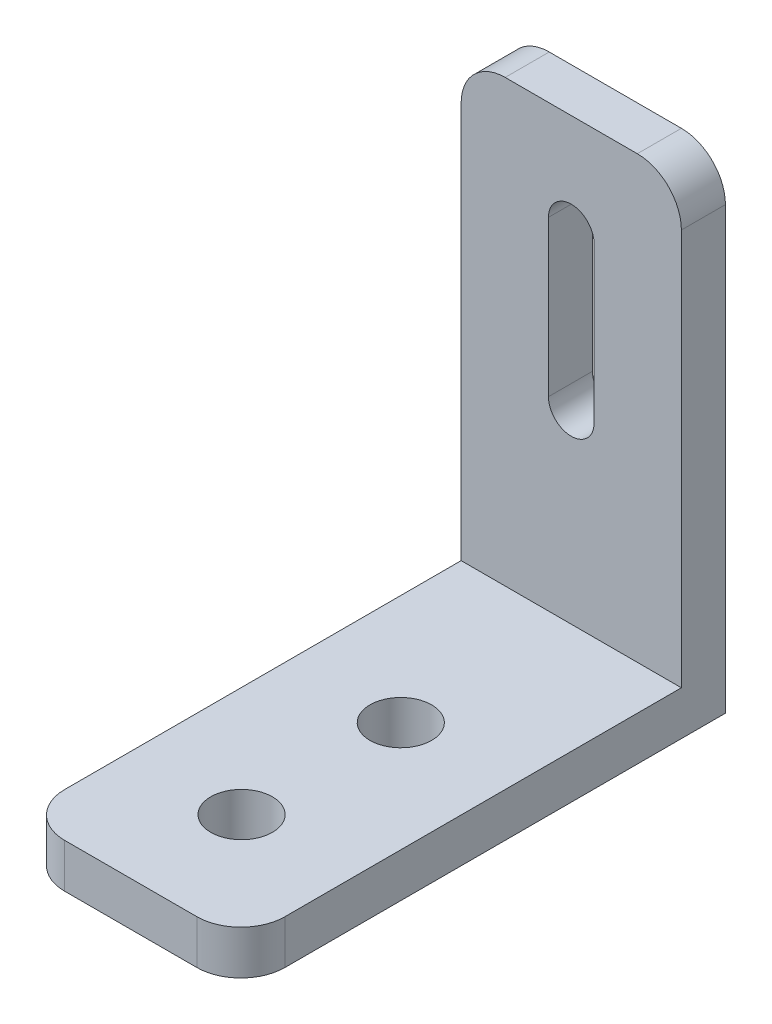
ISO-10303-21;
HEADER;
FILE_DESCRIPTION(('STEP AP214'),'2;1');
FILE_NAME('part.step','',(''),(''),'','','');
FILE_SCHEMA(('AUTOMOTIVE_DESIGN { 1 0 10303 214 1 1 1 1 }'));
ENDSEC;
DATA;
#1=APPLICATION_CONTEXT('core data for automotive mechanical design processes');
#2=APPLICATION_PROTOCOL_DEFINITION('international standard','automotive_design',2000,#1);
#3=PRODUCT_CONTEXT('',#1,'mechanical');
#4=PRODUCT('Part','Part','',(#3));
#5=PRODUCT_RELATED_PRODUCT_CATEGORY('part','',(#4));
#6=PRODUCT_DEFINITION_FORMATION('','',#4);
#7=PRODUCT_DEFINITION_CONTEXT('part definition',#1,'design');
#8=PRODUCT_DEFINITION('design','',#6,#7);
#9=PRODUCT_DEFINITION_SHAPE('','',#8);
#10=(LENGTH_UNIT() NAMED_UNIT(*) SI_UNIT(.MILLI.,.METRE.));
#11=(NAMED_UNIT(*) PLANE_ANGLE_UNIT() SI_UNIT($,.RADIAN.));
#12=(NAMED_UNIT(*) SI_UNIT($,.STERADIAN.) SOLID_ANGLE_UNIT());
#13=UNCERTAINTY_MEASURE_WITH_UNIT(LENGTH_MEASURE(1.E-05),#10,'distance_accuracy_value','');
#14=(GEOMETRIC_REPRESENTATION_CONTEXT(3) GLOBAL_UNCERTAINTY_ASSIGNED_CONTEXT((#13)) GLOBAL_UNIT_ASSIGNED_CONTEXT((#10,
#11,#12)) REPRESENTATION_CONTEXT('',''));
#15=CARTESIAN_POINT('',(0.,0.,0.));
#16=DIRECTION('',(0.,0.,1.));
#17=DIRECTION('',(1.,0.,0.));
#18=AXIS2_PLACEMENT_3D('',#15,#16,#17);
#19=CARTESIAN_POINT('',(50.,0.,-110.));
#20=DIRECTION('',(0.,0.,1.));
#21=DIRECTION('',(1.,0.,0.));
#22=AXIS2_PLACEMENT_3D('',#19,#20,#21);
#23=PLANE('',#22);
#24=DIRECTION('',(0.,1.,0.));
#25=VECTOR('',#24,1.);
#26=CARTESIAN_POINT('',(30.1844729939965,77.3929442277711,-110.));
#27=LINE('',#26,#25);
#28=CARTESIAN_POINT('',(30.1844729939965,42.136183712672,-110.));
#29=VERTEX_POINT('',#28);
#30=CARTESIAN_POINT('',(30.1844729939965,77.3929442277711,-110.));
#31=VERTEX_POINT('',#30);
#32=EDGE_CURVE('E155',#29,#31,#27,.T.);
#33=ORIENTED_EDGE('',*,*,#32,.T.);
#34=CARTESIAN_POINT('',(25.,77.3929442277711,-110.));
#35=DIRECTION('',(0.,0.,1.));
#36=DIRECTION('',(1.,0.,0.));
#37=AXIS2_PLACEMENT_3D('',#34,#35,#36);
#38=CIRCLE('',#37,5.18447299399646);
#39=CARTESIAN_POINT('',(19.8155270060035,77.3929442277711,-110.));
#40=VERTEX_POINT('',#39);
#41=EDGE_CURVE('E148',#31,#40,#38,.T.);
#42=ORIENTED_EDGE('',*,*,#41,.T.);
#43=DIRECTION('',(0.,-1.,0.));
#44=VECTOR('',#43,1.);
#45=CARTESIAN_POINT('',(19.8155270060035,77.3929442277711,-110.));
#46=LINE('',#45,#44);
#47=CARTESIAN_POINT('',(19.8155270060035,42.136183712672,-110.));
#48=VERTEX_POINT('',#47);
#49=EDGE_CURVE('E158',#40,#48,#46,.T.);
#50=ORIENTED_EDGE('',*,*,#49,.T.);
#51=CARTESIAN_POINT('',(25.,42.136183712672,-110.));
#52=DIRECTION('',(0.,0.,1.));
#53=DIRECTION('',(1.,0.,0.));
#54=AXIS2_PLACEMENT_3D('',#51,#52,#53);
#55=CIRCLE('',#54,5.18447299399646);
#56=EDGE_CURVE('E61',#48,#29,#55,.T.);
#57=ORIENTED_EDGE('',*,*,#56,.T.);
#58=EDGE_LOOP('',(#33,#42,#50,#57));
#59=FACE_BOUND('',#58,.T.);
#60=DIRECTION('',(0.,1.,0.));
#61=VECTOR('',#60,1.);
#62=CARTESIAN_POINT('',(0.,0.,-110.));
#63=LINE('',#62,#61);
#64=CARTESIAN_POINT('',(0.,-9.99999999999999,-110.));
#65=VERTEX_POINT('',#64);
#66=CARTESIAN_POINT('',(0.,89.9999999999996,-110.));
#67=VERTEX_POINT('',#66);
#68=EDGE_CURVE('E192',#65,#67,#63,.T.);
#69=ORIENTED_EDGE('',*,*,#68,.T.);
#70=CARTESIAN_POINT('',(10.,89.9999999999996,-110.));
#71=DIRECTION('',(0.,0.,1.));
#72=DIRECTION('',(1.,0.,0.));
#73=AXIS2_PLACEMENT_3D('',#70,#71,#72);
#74=CIRCLE('',#73,10.);
#75=CARTESIAN_POINT('',(10.,99.9999999999996,-110.));
#76=VERTEX_POINT('',#75);
#77=EDGE_CURVE('E260',#67,#76,#74,.F.);
#78=ORIENTED_EDGE('',*,*,#77,.T.);
#79=DIRECTION('',(-1.,0.,0.));
#80=VECTOR('',#79,1.);
#81=CARTESIAN_POINT('',(50.,99.9999999999996,-110.));
#82=LINE('',#81,#80);
#83=CARTESIAN_POINT('',(40.,99.9999999999996,-110.));
#84=VERTEX_POINT('',#83);
#85=EDGE_CURVE('E245',#84,#76,#82,.T.);
#86=ORIENTED_EDGE('',*,*,#85,.F.);
#87=CARTESIAN_POINT('',(40.,89.9999999999996,-110.));
#88=DIRECTION('',(0.,0.,1.));
#89=DIRECTION('',(1.,0.,0.));
#90=AXIS2_PLACEMENT_3D('',#87,#88,#89);
#91=CIRCLE('',#90,10.);
#92=CARTESIAN_POINT('',(50.,89.9999999999996,-110.));
#93=VERTEX_POINT('',#92);
#94=EDGE_CURVE('E257',#84,#93,#91,.F.);
#95=ORIENTED_EDGE('',*,*,#94,.T.);
#96=DIRECTION('',(0.,1.,0.));
#97=VECTOR('',#96,1.);
#98=CARTESIAN_POINT('',(50.,0.,-110.));
#99=LINE('',#98,#97);
#100=CARTESIAN_POINT('',(50.,-9.99999999999999,-110.));
#101=VERTEX_POINT('',#100);
#102=EDGE_CURVE('E198',#101,#93,#99,.T.);
#103=ORIENTED_EDGE('',*,*,#102,.F.);
#104=DIRECTION('',(-1.,0.,0.));
#105=VECTOR('',#104,1.);
#106=CARTESIAN_POINT('',(50.,-9.99999999999999,-110.));
#107=LINE('',#106,#105);
#108=EDGE_CURVE('E213',#101,#65,#107,.T.);
#109=ORIENTED_EDGE('',*,*,#108,.T.);
#110=EDGE_LOOP('',(#69,#78,#86,#95,#103,#109));
#111=FACE_BOUND('',#110,.T.);
#112=ADVANCED_FACE('F45',(#59,#111),#23,.F.);
#113=CARTESIAN_POINT('',(50.,99.9999999999996,-100.));
#114=DIRECTION('',(0.,1.,0.));
#115=DIRECTION('',(0.,0.,1.));
#116=AXIS2_PLACEMENT_3D('',#113,#114,#115);
#117=PLANE('',#116);
#118=ORIENTED_EDGE('',*,*,#85,.T.);
#119=DIRECTION('',(0.,0.,-1.));
#120=VECTOR('',#119,1.);
#121=CARTESIAN_POINT('',(10.,99.9999999999996,-100.));
#122=LINE('',#121,#120);
#123=CARTESIAN_POINT('',(10.,99.9999999999996,-100.));
#124=VERTEX_POINT('',#123);
#125=EDGE_CURVE('E267',#76,#124,#122,.F.);
#126=ORIENTED_EDGE('',*,*,#125,.T.);
#127=DIRECTION('',(-1.,0.,0.));
#128=VECTOR('',#127,1.);
#129=CARTESIAN_POINT('',(50.,99.9999999999996,-100.));
#130=LINE('',#129,#128);
#131=CARTESIAN_POINT('',(40.,99.9999999999996,-100.));
#132=VERTEX_POINT('',#131);
#133=EDGE_CURVE('E241',#132,#124,#130,.T.);
#134=ORIENTED_EDGE('',*,*,#133,.F.);
#135=DIRECTION('',(0.,0.,-1.));
#136=VECTOR('',#135,1.);
#137=CARTESIAN_POINT('',(40.,99.9999999999996,-110.));
#138=LINE('',#137,#136);
#139=EDGE_CURVE('E263',#132,#84,#138,.T.);
#140=ORIENTED_EDGE('',*,*,#139,.T.);
#141=EDGE_LOOP('',(#118,#126,#134,#140));
#142=FACE_BOUND('',#141,.T.);
#143=ADVANCED_FACE('F335',(#142),#117,.T.);
#144=CARTESIAN_POINT('',(50.,0.,-100.));
#145=DIRECTION('',(0.,0.,1.));
#146=DIRECTION('',(1.,0.,0.));
#147=AXIS2_PLACEMENT_3D('',#144,#145,#146);
#148=PLANE('',#147);
#149=CARTESIAN_POINT('',(25.,77.3929442277711,-100.));
#150=DIRECTION('',(0.,0.,1.));
#151=DIRECTION('',(1.,0.,0.));
#152=AXIS2_PLACEMENT_3D('',#149,#150,#151);
#153=CIRCLE('',#152,5.18447299399646);
#154=CARTESIAN_POINT('',(30.1844729939965,77.3929442277711,-100.));
#155=VERTEX_POINT('',#154);
#156=CARTESIAN_POINT('',(19.8155270060035,77.3929442277711,-100.));
#157=VERTEX_POINT('',#156);
#158=EDGE_CURVE('E69',#155,#157,#153,.T.);
#159=ORIENTED_EDGE('',*,*,#158,.F.);
#160=DIRECTION('',(0.,1.,0.));
#161=VECTOR('',#160,1.);
#162=CARTESIAN_POINT('',(30.1844729939965,77.3929442277711,-100.));
#163=LINE('',#162,#161);
#164=CARTESIAN_POINT('',(30.1844729939965,42.136183712672,-100.));
#165=VERTEX_POINT('',#164);
#166=EDGE_CURVE('E166',#165,#155,#163,.T.);
#167=ORIENTED_EDGE('',*,*,#166,.F.);
#168=CARTESIAN_POINT('',(25.,42.136183712672,-100.));
#169=DIRECTION('',(0.,0.,1.));
#170=DIRECTION('',(1.,0.,0.));
#171=AXIS2_PLACEMENT_3D('',#168,#169,#170);
#172=CIRCLE('',#171,5.18447299399646);
#173=CARTESIAN_POINT('',(19.8155270060035,42.136183712672,-100.));
#174=VERTEX_POINT('',#173);
#175=EDGE_CURVE('E170',#174,#165,#172,.T.);
#176=ORIENTED_EDGE('',*,*,#175,.F.);
#177=DIRECTION('',(0.,-1.,0.));
#178=VECTOR('',#177,1.);
#179=CARTESIAN_POINT('',(19.8155270060035,77.3929442277711,-100.));
#180=LINE('',#179,#178);
#181=EDGE_CURVE('E182',#157,#174,#180,.T.);
#182=ORIENTED_EDGE('',*,*,#181,.F.);
#183=EDGE_LOOP('',(#159,#167,#176,#182));
#184=FACE_BOUND('',#183,.T.);
#185=ORIENTED_EDGE('',*,*,#133,.T.);
#186=CARTESIAN_POINT('',(10.,89.9999999999996,-100.));
#187=DIRECTION('',(0.,0.,1.));
#188=DIRECTION('',(1.,0.,0.));
#189=AXIS2_PLACEMENT_3D('',#186,#187,#188);
#190=CIRCLE('',#189,10.);
#191=CARTESIAN_POINT('',(0.,89.9999999999996,-100.));
#192=VERTEX_POINT('',#191);
#193=EDGE_CURVE('E273',#124,#192,#190,.T.);
#194=ORIENTED_EDGE('',*,*,#193,.T.);
#195=DIRECTION('',(0.,1.,0.));
#196=VECTOR('',#195,1.);
#197=CARTESIAN_POINT('',(0.,0.,-100.));
#198=LINE('',#197,#196);
#199=CARTESIAN_POINT('',(0.,0.,-100.));
#200=VERTEX_POINT('',#199);
#201=EDGE_CURVE('E217',#200,#192,#198,.T.);
#202=ORIENTED_EDGE('',*,*,#201,.F.);
#203=DIRECTION('',(-1.,0.,0.));
#204=VECTOR('',#203,1.);
#205=CARTESIAN_POINT('',(50.,0.,-100.));
#206=LINE('',#205,#204);
#207=CARTESIAN_POINT('',(50.,0.,-100.));
#208=VERTEX_POINT('',#207);
#209=EDGE_CURVE('E237',#208,#200,#206,.T.);
#210=ORIENTED_EDGE('',*,*,#209,.F.);
#211=DIRECTION('',(0.,1.,0.));
#212=VECTOR('',#211,1.);
#213=CARTESIAN_POINT('',(50.,0.,-100.));
#214=LINE('',#213,#212);
#215=CARTESIAN_POINT('',(50.,89.9999999999996,-100.));
#216=VERTEX_POINT('',#215);
#217=EDGE_CURVE('E202',#208,#216,#214,.T.);
#218=ORIENTED_EDGE('',*,*,#217,.T.);
#219=CARTESIAN_POINT('',(40.,89.9999999999996,-100.));
#220=DIRECTION('',(0.,0.,1.));
#221=DIRECTION('',(1.,0.,0.));
#222=AXIS2_PLACEMENT_3D('',#219,#220,#221);
#223=CIRCLE('',#222,10.);
#224=EDGE_CURVE('E270',#216,#132,#223,.T.);
#225=ORIENTED_EDGE('',*,*,#224,.T.);
#226=EDGE_LOOP('',(#185,#194,#202,#210,#218,#225));
#227=FACE_BOUND('',#226,.T.);
#228=ADVANCED_FACE('F327',(#184,#227),#148,.T.);
#229=CARTESIAN_POINT('',(50.,0.,0.));
#230=DIRECTION('',(0.,1.,0.));
#231=DIRECTION('',(0.,0.,1.));
#232=AXIS2_PLACEMENT_3D('',#229,#230,#231);
#233=PLANE('',#232);
#234=CARTESIAN_POINT('',(25.,0.,-25.1526702498526));
#235=DIRECTION('',(0.,1.,0.));
#236=DIRECTION('',(0.,0.,1.));
#237=AXIS2_PLACEMENT_3D('',#234,#235,#236);
#238=CIRCLE('',#237,7.);
#239=CARTESIAN_POINT('',(25.,0.,-18.1526702498526));
#240=VERTEX_POINT('',#239);
#241=EDGE_CURVE('E396',#240,#240,#238,.T.);
#242=ORIENTED_EDGE('',*,*,#241,.F.);
#243=EDGE_LOOP('',(#242));
#244=FACE_BOUND('',#243,.T.);
#245=CARTESIAN_POINT('',(25.,0.,-61.3003958321203));
#246=DIRECTION('',(0.,1.,0.));
#247=DIRECTION('',(0.,0.,1.));
#248=AXIS2_PLACEMENT_3D('',#245,#246,#247);
#249=CIRCLE('',#248,7.);
#250=CARTESIAN_POINT('',(25.,0.,-54.3003958321203));
#251=VERTEX_POINT('',#250);
#252=EDGE_CURVE('E398',#251,#251,#249,.T.);
#253=ORIENTED_EDGE('',*,*,#252,.F.);
#254=EDGE_LOOP('',(#253));
#255=FACE_BOUND('',#254,.T.);
#256=DIRECTION('',(-1.,0.,0.));
#257=VECTOR('',#256,1.);
#258=CARTESIAN_POINT('',(50.,0.,0.));
#259=LINE('',#258,#257);
#260=CARTESIAN_POINT('',(40.,0.,0.));
#261=VERTEX_POINT('',#260);
#262=CARTESIAN_POINT('',(10.,0.,0.));
#263=VERTEX_POINT('',#262);
#264=EDGE_CURVE('E233',#261,#263,#259,.T.);
#265=ORIENTED_EDGE('',*,*,#264,.F.);
#266=CARTESIAN_POINT('',(40.,0.,-10.));
#267=DIRECTION('',(0.,1.,0.));
#268=DIRECTION('',(0.,0.,1.));
#269=AXIS2_PLACEMENT_3D('',#266,#267,#268);
#270=CIRCLE('',#269,10.);
#271=CARTESIAN_POINT('',(50.,0.,-10.));
#272=VERTEX_POINT('',#271);
#273=EDGE_CURVE('E292',#261,#272,#270,.T.);
#274=ORIENTED_EDGE('',*,*,#273,.T.);
#275=DIRECTION('',(0.,0.,-1.));
#276=VECTOR('',#275,1.);
#277=CARTESIAN_POINT('',(50.,0.,0.));
#278=LINE('',#277,#276);
#279=EDGE_CURVE('E207',#272,#208,#278,.T.);
#280=ORIENTED_EDGE('',*,*,#279,.T.);
#281=ORIENTED_EDGE('',*,*,#209,.T.);
#282=DIRECTION('',(0.,0.,-1.));
#283=VECTOR('',#282,1.);
#284=CARTESIAN_POINT('',(0.,0.,0.));
#285=LINE('',#284,#283);
#286=CARTESIAN_POINT('',(0.,0.,-10.));
#287=VERTEX_POINT('',#286);
#288=EDGE_CURVE('E221',#287,#200,#285,.T.);
#289=ORIENTED_EDGE('',*,*,#288,.F.);
#290=CARTESIAN_POINT('',(10.,0.,-10.));
#291=DIRECTION('',(0.,1.,0.));
#292=DIRECTION('',(0.,0.,1.));
#293=AXIS2_PLACEMENT_3D('',#290,#291,#292);
#294=CIRCLE('',#293,10.);
#295=EDGE_CURVE('E289',#287,#263,#294,.T.);
#296=ORIENTED_EDGE('',*,*,#295,.T.);
#297=EDGE_LOOP('',(#265,#274,#280,#281,#289,#296));
#298=FACE_BOUND('',#297,.T.);
#299=ADVANCED_FACE('F311',(#244,#255,#298),#233,.T.);
#300=CARTESIAN_POINT('',(50.,-10.,0.));
#301=DIRECTION('',(0.,0.,1.));
#302=DIRECTION('',(0.,-1.,0.));
#303=AXIS2_PLACEMENT_3D('',#300,#301,#302);
#304=PLANE('',#303);
#305=DIRECTION('',(-1.,0.,0.));
#306=VECTOR('',#305,1.);
#307=CARTESIAN_POINT('',(50.,-10.,0.));
#308=LINE('',#307,#306);
#309=CARTESIAN_POINT('',(40.,-10.,0.));
#310=VERTEX_POINT('',#309);
#311=CARTESIAN_POINT('',(10.,-10.,0.));
#312=VERTEX_POINT('',#311);
#313=EDGE_CURVE('E229',#310,#312,#308,.T.);
#314=ORIENTED_EDGE('',*,*,#313,.F.);
#315=DIRECTION('',(0.,1.,0.));
#316=VECTOR('',#315,1.);
#317=CARTESIAN_POINT('',(40.,0.,0.));
#318=LINE('',#317,#316);
#319=EDGE_CURVE('E285',#310,#261,#318,.T.);
#320=ORIENTED_EDGE('',*,*,#319,.T.);
#321=ORIENTED_EDGE('',*,*,#264,.T.);
#322=DIRECTION('',(0.,1.,0.));
#323=VECTOR('',#322,1.);
#324=CARTESIAN_POINT('',(10.,-10.,0.));
#325=LINE('',#324,#323);
#326=EDGE_CURVE('E282',#263,#312,#325,.F.);
#327=ORIENTED_EDGE('',*,*,#326,.T.);
#328=EDGE_LOOP('',(#314,#320,#321,#327));
#329=FACE_BOUND('',#328,.T.);
#330=ADVANCED_FACE('F313',(#329),#304,.T.);
#331=CARTESIAN_POINT('',(50.,-10.,0.));
#332=DIRECTION('',(0.,1.,0.));
#333=DIRECTION('',(0.,0.,1.));
#334=AXIS2_PLACEMENT_3D('',#331,#332,#333);
#335=PLANE('',#334);
#336=CARTESIAN_POINT('',(25.,-10.,-25.1526702498526));
#337=DIRECTION('',(0.,1.,0.));
#338=DIRECTION('',(0.,0.,1.));
#339=AXIS2_PLACEMENT_3D('',#336,#337,#338);
#340=CIRCLE('',#339,7.);
#341=CARTESIAN_POINT('',(25.,-10.,-18.1526702498526));
#342=VERTEX_POINT('',#341);
#343=EDGE_CURVE('E183',#342,#342,#340,.T.);
#344=ORIENTED_EDGE('',*,*,#343,.T.);
#345=EDGE_LOOP('',(#344));
#346=FACE_BOUND('',#345,.T.);
#347=CARTESIAN_POINT('',(25.,-10.,-61.3003958321203));
#348=DIRECTION('',(0.,1.,0.));
#349=DIRECTION('',(0.,0.,1.));
#350=AXIS2_PLACEMENT_3D('',#347,#348,#349);
#351=CIRCLE('',#350,7.);
#352=CARTESIAN_POINT('',(25.,-10.,-54.3003958321203));
#353=VERTEX_POINT('',#352);
#354=EDGE_CURVE('E173',#353,#353,#351,.T.);
#355=ORIENTED_EDGE('',*,*,#354,.T.);
#356=EDGE_LOOP('',(#355));
#357=FACE_BOUND('',#356,.T.);
#358=DIRECTION('',(0.,0.,-1.));
#359=VECTOR('',#358,1.);
#360=CARTESIAN_POINT('',(50.,-10.,0.));
#361=LINE('',#360,#359);
#362=CARTESIAN_POINT('',(50.,-10.,-10.));
#363=VERTEX_POINT('',#362);
#364=EDGE_CURVE('E210',#363,#101,#361,.T.);
#365=ORIENTED_EDGE('',*,*,#364,.F.);
#366=CARTESIAN_POINT('',(40.,-10.,-10.));
#367=DIRECTION('',(0.,1.,0.));
#368=DIRECTION('',(0.,0.,1.));
#369=AXIS2_PLACEMENT_3D('',#366,#367,#368);
#370=CIRCLE('',#369,10.);
#371=EDGE_CURVE('E11',#363,#310,#370,.F.);
#372=ORIENTED_EDGE('',*,*,#371,.T.);
#373=ORIENTED_EDGE('',*,*,#313,.T.);
#374=CARTESIAN_POINT('',(10.,-10.,-10.));
#375=DIRECTION('',(0.,1.,0.));
#376=DIRECTION('',(0.,0.,1.));
#377=AXIS2_PLACEMENT_3D('',#374,#375,#376);
#378=CIRCLE('',#377,10.);
#379=CARTESIAN_POINT('',(0.,-10.,-10.));
#380=VERTEX_POINT('',#379);
#381=EDGE_CURVE('E54',#312,#380,#378,.F.);
#382=ORIENTED_EDGE('',*,*,#381,.T.);
#383=DIRECTION('',(0.,0.,-1.));
#384=VECTOR('',#383,1.);
#385=CARTESIAN_POINT('',(0.,-10.,0.));
#386=LINE('',#385,#384);
#387=EDGE_CURVE('E203',#380,#65,#386,.T.);
#388=ORIENTED_EDGE('',*,*,#387,.T.);
#389=ORIENTED_EDGE('',*,*,#108,.F.);
#390=EDGE_LOOP('',(#365,#372,#373,#382,#388,#389));
#391=FACE_BOUND('',#390,.T.);
#392=ADVANCED_FACE('F299',(#346,#357,#391),#335,.F.);
#393=CARTESIAN_POINT('',(50.,0.,0.));
#394=DIRECTION('',(-1.,0.,0.));
#395=DIRECTION('',(0.,0.,1.));
#396=AXIS2_PLACEMENT_3D('',#393,#394,#395);
#397=PLANE('',#396);
#398=ORIENTED_EDGE('',*,*,#102,.T.);
#399=DIRECTION('',(0.,0.,-1.));
#400=VECTOR('',#399,1.);
#401=CARTESIAN_POINT('',(50.,89.9999999999996,-100.));
#402=LINE('',#401,#400);
#403=EDGE_CURVE('E279',#93,#216,#402,.F.);
#404=ORIENTED_EDGE('',*,*,#403,.T.);
#405=ORIENTED_EDGE('',*,*,#217,.F.);
#406=ORIENTED_EDGE('',*,*,#279,.F.);
#407=DIRECTION('',(0.,1.,0.));
#408=VECTOR('',#407,1.);
#409=CARTESIAN_POINT('',(50.,-10.,-10.));
#410=LINE('',#409,#408);
#411=EDGE_CURVE('E276',#272,#363,#410,.F.);
#412=ORIENTED_EDGE('',*,*,#411,.T.);
#413=ORIENTED_EDGE('',*,*,#364,.T.);
#414=EDGE_LOOP('',(#398,#404,#405,#406,#412,#413));
#415=FACE_BOUND('',#414,.T.);
#416=ADVANCED_FACE('F323',(#415),#397,.F.);
#417=CARTESIAN_POINT('',(0.,0.,0.));
#418=DIRECTION('',(-1.,0.,0.));
#419=DIRECTION('',(0.,0.,1.));
#420=AXIS2_PLACEMENT_3D('',#417,#418,#419);
#421=PLANE('',#420);
#422=ORIENTED_EDGE('',*,*,#201,.T.);
#423=DIRECTION('',(0.,0.,-1.));
#424=VECTOR('',#423,1.);
#425=CARTESIAN_POINT('',(0.,89.9999999999996,0.));
#426=LINE('',#425,#424);
#427=EDGE_CURVE('E253',#192,#67,#426,.T.);
#428=ORIENTED_EDGE('',*,*,#427,.T.);
#429=ORIENTED_EDGE('',*,*,#68,.F.);
#430=ORIENTED_EDGE('',*,*,#387,.F.);
#431=DIRECTION('',(0.,1.,0.));
#432=VECTOR('',#431,1.);
#433=CARTESIAN_POINT('',(0.,0.,-10.));
#434=LINE('',#433,#432);
#435=EDGE_CURVE('E249',#380,#287,#434,.T.);
#436=ORIENTED_EDGE('',*,*,#435,.T.);
#437=ORIENTED_EDGE('',*,*,#288,.T.);
#438=EDGE_LOOP('',(#422,#428,#429,#430,#436,#437));
#439=FACE_BOUND('',#438,.T.);
#440=ADVANCED_FACE('F307',(#439),#421,.T.);
#441=CARTESIAN_POINT('',(10.,89.9999999999996,0.));
#442=DIRECTION('',(0.,0.,-1.));
#443=DIRECTION('',(-1.,0.,0.));
#444=AXIS2_PLACEMENT_3D('',#441,#442,#443);
#445=CYLINDRICAL_SURFACE('',#444,10.);
#446=ORIENTED_EDGE('',*,*,#193,.F.);
#447=ORIENTED_EDGE('',*,*,#125,.F.);
#448=ORIENTED_EDGE('',*,*,#77,.F.);
#449=ORIENTED_EDGE('',*,*,#427,.F.);
#450=EDGE_LOOP('',(#446,#447,#448,#449));
#451=FACE_BOUND('',#450,.T.);
#452=ADVANCED_FACE('F341',(#451),#445,.T.);
#453=CARTESIAN_POINT('',(40.,89.9999999999996,-100.));
#454=DIRECTION('',(0.,0.,1.));
#455=DIRECTION('',(1.,0.,0.));
#456=AXIS2_PLACEMENT_3D('',#453,#454,#455);
#457=CYLINDRICAL_SURFACE('',#456,10.);
#458=ORIENTED_EDGE('',*,*,#224,.F.);
#459=ORIENTED_EDGE('',*,*,#403,.F.);
#460=ORIENTED_EDGE('',*,*,#94,.F.);
#461=ORIENTED_EDGE('',*,*,#139,.F.);
#462=EDGE_LOOP('',(#458,#459,#460,#461));
#463=FACE_BOUND('',#462,.T.);
#464=ADVANCED_FACE('F332',(#463),#457,.T.);
#465=CARTESIAN_POINT('',(40.,-10.,-10.));
#466=DIRECTION('',(0.,-1.,0.));
#467=DIRECTION('',(0.,0.,-1.));
#468=AXIS2_PLACEMENT_3D('',#465,#466,#467);
#469=CYLINDRICAL_SURFACE('',#468,10.);
#470=ORIENTED_EDGE('',*,*,#371,.F.);
#471=ORIENTED_EDGE('',*,*,#411,.F.);
#472=ORIENTED_EDGE('',*,*,#273,.F.);
#473=ORIENTED_EDGE('',*,*,#319,.F.);
#474=EDGE_LOOP('',(#470,#471,#472,#473));
#475=FACE_BOUND('',#474,.T.);
#476=ADVANCED_FACE('F317',(#475),#469,.T.);
#477=CARTESIAN_POINT('',(10.,0.,-10.));
#478=DIRECTION('',(0.,1.,0.));
#479=DIRECTION('',(0.,0.,1.));
#480=AXIS2_PLACEMENT_3D('',#477,#478,#479);
#481=CYLINDRICAL_SURFACE('',#480,10.);
#482=ORIENTED_EDGE('',*,*,#381,.F.);
#483=ORIENTED_EDGE('',*,*,#326,.F.);
#484=ORIENTED_EDGE('',*,*,#295,.F.);
#485=ORIENTED_EDGE('',*,*,#435,.F.);
#486=EDGE_LOOP('',(#482,#483,#484,#485));
#487=FACE_BOUND('',#486,.T.);
#488=ADVANCED_FACE('F47',(#487),#481,.T.);
#489=CARTESIAN_POINT('',(25.,77.3929442277711,-110.));
#490=DIRECTION('',(0.,0.,1.));
#491=DIRECTION('',(1.,0.,0.));
#492=AXIS2_PLACEMENT_3D('',#489,#490,#491);
#493=CYLINDRICAL_SURFACE('',#492,5.18447299399646);
#494=ORIENTED_EDGE('',*,*,#158,.T.);
#495=DIRECTION('',(0.,0.,1.));
#496=VECTOR('',#495,1.);
#497=CARTESIAN_POINT('',(19.8155270060035,77.3929442277711,-110.));
#498=LINE('',#497,#496);
#499=EDGE_CURVE('E144',#40,#157,#498,.T.);
#500=ORIENTED_EDGE('',*,*,#499,.F.);
#501=ORIENTED_EDGE('',*,*,#41,.F.);
#502=DIRECTION('',(0.,0.,1.));
#503=VECTOR('',#502,1.);
#504=CARTESIAN_POINT('',(30.1844729939965,77.3929442277711,-110.));
#505=LINE('',#504,#503);
#506=EDGE_CURVE('E189',#31,#155,#505,.T.);
#507=ORIENTED_EDGE('',*,*,#506,.T.);
#508=EDGE_LOOP('',(#494,#500,#501,#507));
#509=FACE_BOUND('',#508,.T.);
#510=ADVANCED_FACE('F146',(#509),#493,.F.);
#511=CARTESIAN_POINT('',(30.1844729939965,77.3929442277711,-110.));
#512=DIRECTION('',(1.,0.,0.));
#513=DIRECTION('',(0.,0.,-1.));
#514=AXIS2_PLACEMENT_3D('',#511,#512,#513);
#515=PLANE('',#514);
#516=ORIENTED_EDGE('',*,*,#166,.T.);
#517=ORIENTED_EDGE('',*,*,#506,.F.);
#518=ORIENTED_EDGE('',*,*,#32,.F.);
#519=DIRECTION('',(0.,0.,1.));
#520=VECTOR('',#519,1.);
#521=CARTESIAN_POINT('',(30.1844729939965,42.136183712672,-110.));
#522=LINE('',#521,#520);
#523=EDGE_CURVE('E193',#29,#165,#522,.T.);
#524=ORIENTED_EDGE('',*,*,#523,.T.);
#525=EDGE_LOOP('',(#516,#517,#518,#524));
#526=FACE_BOUND('',#525,.T.);
#527=ADVANCED_FACE('F373',(#526),#515,.F.);
#528=CARTESIAN_POINT('',(25.,42.136183712672,-110.));
#529=DIRECTION('',(0.,0.,1.));
#530=DIRECTION('',(1.,0.,0.));
#531=AXIS2_PLACEMENT_3D('',#528,#529,#530);
#532=CYLINDRICAL_SURFACE('',#531,5.18447299399646);
#533=ORIENTED_EDGE('',*,*,#175,.T.);
#534=ORIENTED_EDGE('',*,*,#523,.F.);
#535=ORIENTED_EDGE('',*,*,#56,.F.);
#536=DIRECTION('',(0.,0.,1.));
#537=VECTOR('',#536,1.);
#538=CARTESIAN_POINT('',(19.8155270060035,42.136183712672,-110.));
#539=LINE('',#538,#537);
#540=EDGE_CURVE('E154',#48,#174,#539,.T.);
#541=ORIENTED_EDGE('',*,*,#540,.T.);
#542=EDGE_LOOP('',(#533,#534,#535,#541));
#543=FACE_BOUND('',#542,.T.);
#544=ADVANCED_FACE('F377',(#543),#532,.F.);
#545=CARTESIAN_POINT('',(19.8155270060035,77.3929442277711,-110.));
#546=DIRECTION('',(-1.,0.,0.));
#547=DIRECTION('',(0.,0.,1.));
#548=AXIS2_PLACEMENT_3D('',#545,#546,#547);
#549=PLANE('',#548);
#550=ORIENTED_EDGE('',*,*,#181,.T.);
#551=ORIENTED_EDGE('',*,*,#540,.F.);
#552=ORIENTED_EDGE('',*,*,#49,.F.);
#553=ORIENTED_EDGE('',*,*,#499,.T.);
#554=EDGE_LOOP('',(#550,#551,#552,#553));
#555=FACE_BOUND('',#554,.T.);
#556=ADVANCED_FACE('F159',(#555),#549,.F.);
#557=CARTESIAN_POINT('',(25.,-10.,-61.3003958321203));
#558=DIRECTION('',(0.,1.,0.));
#559=DIRECTION('',(0.,0.,1.));
#560=AXIS2_PLACEMENT_3D('',#557,#558,#559);
#561=CYLINDRICAL_SURFACE('',#560,7.);
#562=ORIENTED_EDGE('',*,*,#354,.F.);
#563=EDGE_LOOP('',(#562));
#564=FACE_BOUND('',#563,.T.);
#565=ORIENTED_EDGE('',*,*,#252,.T.);
#566=EDGE_LOOP('',(#565));
#567=FACE_BOUND('',#566,.T.);
#568=ADVANCED_FACE('F376',(#564,#567),#561,.F.);
#569=CARTESIAN_POINT('',(25.,-10.,-25.1526702498526));
#570=DIRECTION('',(0.,1.,0.));
#571=DIRECTION('',(0.,0.,1.));
#572=AXIS2_PLACEMENT_3D('',#569,#570,#571);
#573=CYLINDRICAL_SURFACE('',#572,7.);
#574=ORIENTED_EDGE('',*,*,#343,.F.);
#575=EDGE_LOOP('',(#574));
#576=FACE_BOUND('',#575,.T.);
#577=ORIENTED_EDGE('',*,*,#241,.T.);
#578=EDGE_LOOP('',(#577));
#579=FACE_BOUND('',#578,.T.);
#580=ADVANCED_FACE('F385',(#576,#579),#573,.F.);
#581=CLOSED_SHELL('',(#112,#143,#228,#299,#330,#392,#416,#440,#452,#464,#476,#488,#510,#527,
#544,#556,#568,#580));
#582=MANIFOLD_SOLID_BREP('B2',#581);
#583=ADVANCED_BREP_SHAPE_REPRESENTATION('',(#18,#582),#14);
#584=SHAPE_DEFINITION_REPRESENTATION(#9,#583);
ENDSEC;
END-ISO-10303-21;
